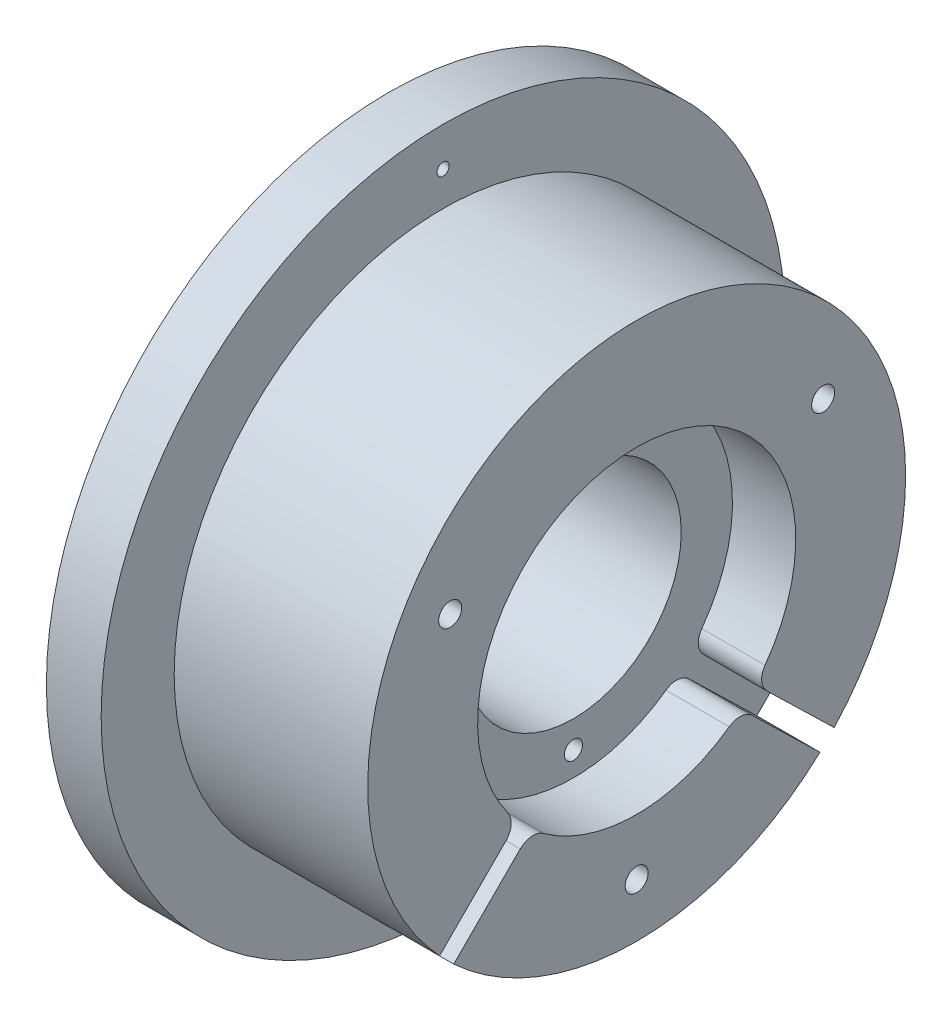
ISO-10303-21;
HEADER;
FILE_DESCRIPTION(('STEP AP214'),'2;1');
FILE_NAME('part.step','',(''),(''),'','','');
FILE_SCHEMA(('AUTOMOTIVE_DESIGN { 1 0 10303 214 1 1 1 1 }'));
ENDSEC;
DATA;
#1=APPLICATION_CONTEXT('core data for automotive mechanical design processes');
#2=APPLICATION_PROTOCOL_DEFINITION('international standard','automotive_design',2000,#1);
#3=PRODUCT_CONTEXT('',#1,'mechanical');
#4=PRODUCT('Part','Part','',(#3));
#5=PRODUCT_RELATED_PRODUCT_CATEGORY('part','',(#4));
#6=PRODUCT_DEFINITION_FORMATION('','',#4);
#7=PRODUCT_DEFINITION_CONTEXT('part definition',#1,'design');
#8=PRODUCT_DEFINITION('design','',#6,#7);
#9=PRODUCT_DEFINITION_SHAPE('','',#8);
#10=(LENGTH_UNIT() NAMED_UNIT(*) SI_UNIT(.MILLI.,.METRE.));
#11=(NAMED_UNIT(*) PLANE_ANGLE_UNIT() SI_UNIT($,.RADIAN.));
#12=(NAMED_UNIT(*) SI_UNIT($,.STERADIAN.) SOLID_ANGLE_UNIT());
#13=UNCERTAINTY_MEASURE_WITH_UNIT(LENGTH_MEASURE(1.E-05),#10,'distance_accuracy_value','');
#14=(GEOMETRIC_REPRESENTATION_CONTEXT(3) GLOBAL_UNCERTAINTY_ASSIGNED_CONTEXT((#13)) GLOBAL_UNIT_ASSIGNED_CONTEXT((#10,
#11,#12)) REPRESENTATION_CONTEXT('',''));
#15=CARTESIAN_POINT('',(0.,0.,0.));
#16=DIRECTION('',(0.,0.,1.));
#17=DIRECTION('',(1.,0.,0.));
#18=AXIS2_PLACEMENT_3D('',#15,#16,#17);
#19=CARTESIAN_POINT('',(12.872,0.,0.));
#20=DIRECTION('',(1.,0.,0.));
#21=DIRECTION('',(0.,0.,-1.));
#22=AXIS2_PLACEMENT_3D('',#19,#20,#21);
#23=CYLINDRICAL_SURFACE('',#22,11.0635);
#24=CARTESIAN_POINT('',(17.272,0.,0.));
#25=DIRECTION('',(1.,0.,0.));
#26=DIRECTION('',(0.,0.,-1.));
#27=AXIS2_PLACEMENT_3D('',#24,#25,#26);
#28=CIRCLE('',#27,11.0635);
#29=CARTESIAN_POINT('',(17.272,-6.53055533839923,-8.93044675378032));
#30=VERTEX_POINT('',#29);
#31=CARTESIAN_POINT('',(17.272,-6.48547246653702,8.96324043724089));
#32=VERTEX_POINT('',#31);
#33=EDGE_CURVE('E270',#30,#32,#28,.T.);
#34=ORIENTED_EDGE('',*,*,#33,.T.);
#35=DIRECTION('',(1.,0.,0.));
#36=VECTOR('',#35,1.);
#37=CARTESIAN_POINT('',(12.872,-6.48547246653702,8.96324043724089));
#38=LINE('',#37,#36);
#39=CARTESIAN_POINT('',(12.872,-6.48547246653702,8.96324043724089));
#40=VERTEX_POINT('',#39);
#41=EDGE_CURVE('E289',#32,#40,#38,.F.);
#42=ORIENTED_EDGE('',*,*,#41,.T.);
#43=CARTESIAN_POINT('',(12.872,0.,0.));
#44=DIRECTION('',(1.,0.,0.));
#45=DIRECTION('',(0.,0.,-1.));
#46=AXIS2_PLACEMENT_3D('',#43,#44,#45);
#47=CIRCLE('',#46,11.0635);
#48=CARTESIAN_POINT('',(12.872,-6.53055533839923,-8.93044675378032));
#49=VERTEX_POINT('',#48);
#50=EDGE_CURVE('E274',#49,#40,#47,.T.);
#51=ORIENTED_EDGE('',*,*,#50,.F.);
#52=DIRECTION('',(1.,0.,0.));
#53=VECTOR('',#52,1.);
#54=CARTESIAN_POINT('',(12.872,-6.53055533839923,-8.93044675378032));
#55=LINE('',#54,#53);
#56=EDGE_CURVE('E287',#49,#30,#55,.T.);
#57=ORIENTED_EDGE('',*,*,#56,.T.);
#58=EDGE_LOOP('',(#34,#42,#51,#57));
#59=FACE_BOUND('',#58,.T.);
#60=ADVANCED_FACE('F77',(#59),#23,.F.);
#61=CARTESIAN_POINT('',(12.872,-8.963240437241,6.48547246653686));
#62=VERTEX_POINT('',#61);
#63=CARTESIAN_POINT('',(12.872,-8.99622472916227,-6.43964074094272));
#64=VERTEX_POINT('',#63);
#65=EDGE_CURVE('E275',#62,#64,#47,.T.);
#66=ORIENTED_EDGE('',*,*,#65,.F.);
#67=DIRECTION('',(1.,0.,0.));
#68=VECTOR('',#67,1.);
#69=CARTESIAN_POINT('',(12.872,-8.96324043724101,6.48547246653686));
#70=LINE('',#69,#68);
#71=CARTESIAN_POINT('',(17.272,-8.963240437241,6.48547246653686));
#72=VERTEX_POINT('',#71);
#73=EDGE_CURVE('E296',#62,#72,#70,.T.);
#74=ORIENTED_EDGE('',*,*,#73,.T.);
#75=CARTESIAN_POINT('',(17.272,-8.99622472916227,-6.43964074094272));
#76=VERTEX_POINT('',#75);
#77=EDGE_CURVE('E271',#72,#76,#28,.T.);
#78=ORIENTED_EDGE('',*,*,#77,.T.);
#79=DIRECTION('',(1.,0.,0.));
#80=VECTOR('',#79,1.);
#81=CARTESIAN_POINT('',(12.872,-8.99622472916227,-6.43964074094272));
#82=LINE('',#81,#80);
#83=EDGE_CURVE('E294',#76,#64,#82,.F.);
#84=ORIENTED_EDGE('',*,*,#83,.T.);
#85=EDGE_LOOP('',(#66,#74,#78,#84));
#86=FACE_BOUND('',#85,.T.);
#87=ADVANCED_FACE('F317',(#86),#23,.F.);
#88=CARTESIAN_POINT('',(17.272,0.,0.));
#89=DIRECTION('',(-1.,0.,0.));
#90=DIRECTION('',(0.,0.,1.));
#91=AXIS2_PLACEMENT_3D('',#88,#89,#90);
#92=PLANE('',#91);
#93=CARTESIAN_POINT('',(17.272,7.48875,12.9708954851814));
#94=DIRECTION('',(1.,0.,0.));
#95=DIRECTION('',(0.,0.,-1.));
#96=AXIS2_PLACEMENT_3D('',#93,#94,#95);
#97=CIRCLE('',#96,0.79999999999999);
#98=CARTESIAN_POINT('',(17.272,7.48875,12.1708954851814));
#99=VERTEX_POINT('',#98);
#100=EDGE_CURVE('E183',#99,#99,#97,.T.);
#101=ORIENTED_EDGE('',*,*,#100,.F.);
#102=EDGE_LOOP('',(#101));
#103=FACE_BOUND('',#102,.T.);
#104=CARTESIAN_POINT('',(17.272,7.48875000000001,-12.9708954851814));
#105=DIRECTION('',(1.,0.,0.));
#106=DIRECTION('',(0.,0.,-1.));
#107=AXIS2_PLACEMENT_3D('',#104,#105,#106);
#108=CIRCLE('',#107,0.79999999999999);
#109=CARTESIAN_POINT('',(17.272,7.48875000000001,-13.7708954851814));
#110=VERTEX_POINT('',#109);
#111=EDGE_CURVE('E182',#110,#110,#108,.T.);
#112=ORIENTED_EDGE('',*,*,#111,.F.);
#113=EDGE_LOOP('',(#112));
#114=FACE_BOUND('',#113,.T.);
#115=DIRECTION('',(0.,0.707106781186554,-0.707106781186541));
#116=VECTOR('',#115,1.);
#117=CARTESIAN_POINT('',(17.272,0.494974746830583,0.494974746830592));
#118=LINE('',#117,#116);
#119=CARTESIAN_POINT('',(17.272,-12.7236785584424,13.7136280521033));
#120=VERTEX_POINT('',#119);
#121=CARTESIAN_POINT('',(17.272,-8.1021114528653,9.09206094652632));
#122=VERTEX_POINT('',#121);
#123=EDGE_CURVE('E240',#120,#122,#118,.T.);
#124=ORIENTED_EDGE('',*,*,#123,.T.);
#125=CARTESIAN_POINT('',(17.272,-7.21822797638212,9.97594442300951));
#126=DIRECTION('',(-1.,0.,0.));
#127=DIRECTION('',(0.,0.,1.));
#128=AXIS2_PLACEMENT_3D('',#125,#126,#127);
#129=CIRCLE('',#128,1.25);
#130=EDGE_CURVE('E285',#122,#32,#129,.F.);
#131=ORIENTED_EDGE('',*,*,#130,.T.);
#132=ORIENTED_EDGE('',*,*,#33,.F.);
#133=CARTESIAN_POINT('',(17.272,-7.26840449761638,-9.9394455735232));
#134=DIRECTION('',(-1.,0.,0.));
#135=DIRECTION('',(0.,0.,1.));
#136=AXIS2_PLACEMENT_3D('',#133,#134,#135);
#137=CIRCLE('',#136,1.25);
#138=CARTESIAN_POINT('',(17.272,-8.16548854366934,-9.06896282566586));
#139=VERTEX_POINT('',#138);
#140=EDGE_CURVE('E283',#30,#139,#137,.F.);
#141=ORIENTED_EDGE('',*,*,#140,.T.);
#142=DIRECTION('',(0.,-0.696386198285868,-0.717667236842365));
#143=VECTOR('',#142,1.);
#144=CARTESIAN_POINT('',(17.272,0.326823466436906,-0.317132146514021));
#145=LINE('',#144,#143);
#146=CARTESIAN_POINT('',(17.272,-12.6966821527148,-13.7386263040718));
#147=VERTEX_POINT('',#146);
#148=EDGE_CURVE('E218',#139,#147,#145,.T.);
#149=ORIENTED_EDGE('',*,*,#148,.T.);
#150=CARTESIAN_POINT('',(17.272,0.,0.));
#151=DIRECTION('',(1.,0.,0.));
#152=DIRECTION('',(0.,0.,-1.));
#153=AXIS2_PLACEMENT_3D('',#150,#151,#152);
#154=CIRCLE('',#153,18.7071);
#155=EDGE_CURVE('E266',#147,#120,#154,.T.);
#156=ORIENTED_EDGE('',*,*,#155,.T.);
#157=EDGE_LOOP('',(#124,#131,#132,#141,#149,#156));
#158=FACE_BOUND('',#157,.T.);
#159=ADVANCED_FACE('F354',(#103,#114,#158),#92,.F.);
#160=CARTESIAN_POINT('',(17.272,-14.9775,0.));
#161=DIRECTION('',(1.,0.,0.));
#162=DIRECTION('',(0.,0.,-1.));
#163=AXIS2_PLACEMENT_3D('',#160,#161,#162);
#164=CIRCLE('',#163,0.79999999999999);
#165=CARTESIAN_POINT('',(17.272,-14.9775,-0.799999999999992));
#166=VERTEX_POINT('',#165);
#167=EDGE_CURVE('E193',#166,#166,#164,.T.);
#168=ORIENTED_EDGE('',*,*,#167,.F.);
#169=EDGE_LOOP('',(#168));
#170=FACE_BOUND('',#169,.T.);
#171=ORIENTED_EDGE('',*,*,#77,.F.);
#172=CARTESIAN_POINT('',(17.272,-9.97594442300963,7.21822797638195));
#173=DIRECTION('',(-1.,0.,0.));
#174=DIRECTION('',(0.,0.,1.));
#175=AXIS2_PLACEMENT_3D('',#172,#173,#174);
#176=CIRCLE('',#175,1.25);
#177=CARTESIAN_POINT('',(17.272,-9.09206094652646,8.10211145286514));
#178=VERTEX_POINT('',#177);
#179=EDGE_CURVE('E300',#72,#178,#176,.F.);
#180=ORIENTED_EDGE('',*,*,#179,.T.);
#181=DIRECTION('',(0.,-0.707106781186553,0.707106781186542));
#182=VECTOR('',#181,1.);
#183=CARTESIAN_POINT('',(17.272,-0.494974746830585,-0.494974746830593));
#184=LINE('',#183,#182);
#185=CARTESIAN_POINT('',(17.272,-13.7136280521035,12.7236785584421));
#186=VERTEX_POINT('',#185);
#187=EDGE_CURVE('E236',#178,#186,#184,.T.);
#188=ORIENTED_EDGE('',*,*,#187,.T.);
#189=CARTESIAN_POINT('',(17.272,-13.6886585047887,-12.7505379788179));
#190=VERTEX_POINT('',#189);
#191=EDGE_CURVE('E267',#186,#190,#154,.T.);
#192=ORIENTED_EDGE('',*,*,#191,.T.);
#193=DIRECTION('',(0.,0.696386198285868,0.717667236842366));
#194=VECTOR('',#193,1.);
#195=CARTESIAN_POINT('',(17.272,-0.677910665142419,0.657808531086206));
#196=LINE('',#195,#194);
#197=CARTESIAN_POINT('',(17.272,-9.11557137063612,-8.03770074068042));
#198=VERTEX_POINT('',#197);
#199=EDGE_CURVE('E222',#190,#198,#196,.T.);
#200=ORIENTED_EDGE('',*,*,#199,.T.);
#201=CARTESIAN_POINT('',(17.272,-10.0126554166891,-7.16721799282308));
#202=DIRECTION('',(-1.,0.,0.));
#203=DIRECTION('',(0.,0.,1.));
#204=AXIS2_PLACEMENT_3D('',#201,#202,#203);
#205=CIRCLE('',#204,1.25);
#206=EDGE_CURVE('E298',#198,#76,#205,.F.);
#207=ORIENTED_EDGE('',*,*,#206,.T.);
#208=EDGE_LOOP('',(#171,#180,#188,#192,#200,#207));
#209=FACE_BOUND('',#208,.T.);
#210=ADVANCED_FACE('F324',(#170,#209),#92,.F.);
#211=CARTESIAN_POINT('',(12.872,0.,0.));
#212=DIRECTION('',(1.,0.,0.));
#213=DIRECTION('',(0.,0.,-1.));
#214=AXIS2_PLACEMENT_3D('',#211,#212,#213);
#215=CYLINDRICAL_SURFACE('',#214,18.7071);
#216=CARTESIAN_POINT('',(3.81,0.,0.));
#217=DIRECTION('',(1.,0.,0.));
#218=DIRECTION('',(0.,0.,-1.));
#219=AXIS2_PLACEMENT_3D('',#216,#217,#218);
#220=CIRCLE('',#219,18.7071);
#221=CARTESIAN_POINT('',(3.81,0.,-18.7071));
#222=VERTEX_POINT('',#221);
#223=EDGE_CURVE('E263',#222,#222,#220,.T.);
#224=ORIENTED_EDGE('',*,*,#223,.T.);
#225=EDGE_LOOP('',(#224));
#226=FACE_BOUND('',#225,.T.);
#227=DIRECTION('',(1.,0.,0.));
#228=VECTOR('',#227,1.);
#229=CARTESIAN_POINT('',(-6.87510074540848,-12.6966821527148,-13.7386263040718));
#230=LINE('',#229,#228);
#231=CARTESIAN_POINT('',(12.872,-12.6966821527148,-13.7386263040718));
#232=VERTEX_POINT('',#231);
#233=EDGE_CURVE('E221',#232,#147,#230,.T.);
#234=ORIENTED_EDGE('',*,*,#233,.F.);
#235=CARTESIAN_POINT('',(12.872,0.,0.));
#236=DIRECTION('',(-1.,0.,0.));
#237=DIRECTION('',(0.,0.,1.));
#238=AXIS2_PLACEMENT_3D('',#235,#236,#237);
#239=CIRCLE('',#238,18.7071);
#240=CARTESIAN_POINT('',(12.872,-13.6886585047887,-12.7505379788179));
#241=VERTEX_POINT('',#240);
#242=EDGE_CURVE('E226',#241,#232,#239,.F.);
#243=ORIENTED_EDGE('',*,*,#242,.F.);
#244=DIRECTION('',(1.,0.,0.));
#245=VECTOR('',#244,1.);
#246=CARTESIAN_POINT('',(-6.87510074540848,-13.6886585047887,-12.7505379788179));
#247=LINE('',#246,#245);
#248=EDGE_CURVE('E220',#241,#190,#247,.T.);
#249=ORIENTED_EDGE('',*,*,#248,.T.);
#250=ORIENTED_EDGE('',*,*,#191,.F.);
#251=DIRECTION('',(1.,0.,0.));
#252=VECTOR('',#251,1.);
#253=CARTESIAN_POINT('',(-6.87510074540848,-13.7136280521035,12.7236785584421));
#254=LINE('',#253,#252);
#255=CARTESIAN_POINT('',(12.872,-13.7136280521035,12.7236785584421));
#256=VERTEX_POINT('',#255);
#257=EDGE_CURVE('E239',#256,#186,#254,.T.);
#258=ORIENTED_EDGE('',*,*,#257,.F.);
#259=CARTESIAN_POINT('',(12.872,0.,0.));
#260=DIRECTION('',(-1.,0.,0.));
#261=DIRECTION('',(0.,0.,1.));
#262=AXIS2_PLACEMENT_3D('',#259,#260,#261);
#263=CIRCLE('',#262,18.7071);
#264=CARTESIAN_POINT('',(12.872,-12.7236785584424,13.7136280521033));
#265=VERTEX_POINT('',#264);
#266=EDGE_CURVE('E243',#265,#256,#263,.F.);
#267=ORIENTED_EDGE('',*,*,#266,.F.);
#268=DIRECTION('',(1.,0.,0.));
#269=VECTOR('',#268,1.);
#270=CARTESIAN_POINT('',(-6.87510074540848,-12.7236785584424,13.7136280521033));
#271=LINE('',#270,#269);
#272=EDGE_CURVE('E244',#265,#120,#271,.T.);
#273=ORIENTED_EDGE('',*,*,#272,.T.);
#274=ORIENTED_EDGE('',*,*,#155,.F.);
#275=EDGE_LOOP('',(#234,#243,#249,#250,#258,#267,#273,#274));
#276=FACE_BOUND('',#275,.T.);
#277=ADVANCED_FACE('F332',(#226,#276),#215,.T.);
#278=CARTESIAN_POINT('',(12.872,0.,0.));
#279=DIRECTION('',(1.,0.,0.));
#280=DIRECTION('',(0.,0.,-1.));
#281=AXIS2_PLACEMENT_3D('',#278,#279,#280);
#282=CYLINDRICAL_SURFACE('',#281,7.5);
#283=CARTESIAN_POINT('',(0.,0.,0.));
#284=DIRECTION('',(1.,0.,0.));
#285=DIRECTION('',(0.,0.,-1.));
#286=AXIS2_PLACEMENT_3D('',#283,#284,#285);
#287=CIRCLE('',#286,7.5);
#288=CARTESIAN_POINT('',(0.,0.,-7.5));
#289=VERTEX_POINT('',#288);
#290=EDGE_CURVE('E238',#289,#289,#287,.T.);
#291=ORIENTED_EDGE('',*,*,#290,.F.);
#292=EDGE_LOOP('',(#291));
#293=FACE_BOUND('',#292,.T.);
#294=CARTESIAN_POINT('',(12.872,0.,0.));
#295=DIRECTION('',(1.,0.,0.));
#296=DIRECTION('',(0.,0.,-1.));
#297=AXIS2_PLACEMENT_3D('',#294,#295,#296);
#298=CIRCLE('',#297,7.5);
#299=CARTESIAN_POINT('',(12.872,0.,-7.5));
#300=VERTEX_POINT('',#299);
#301=EDGE_CURVE('E277',#300,#300,#298,.T.);
#302=ORIENTED_EDGE('',*,*,#301,.T.);
#303=EDGE_LOOP('',(#302));
#304=FACE_BOUND('',#303,.T.);
#305=ADVANCED_FACE('F362',(#293,#304),#282,.F.);
#306=CARTESIAN_POINT('',(12.872,0.,0.));
#307=DIRECTION('',(-1.,0.,0.));
#308=DIRECTION('',(0.,0.,1.));
#309=AXIS2_PLACEMENT_3D('',#306,#307,#308);
#310=PLANE('',#309);
#311=CARTESIAN_POINT('',(12.872,9.375,0.));
#312=DIRECTION('',(1.,0.,0.));
#313=DIRECTION('',(0.,1.,0.));
#314=AXIS2_PLACEMENT_3D('',#311,#312,#313);
#315=CIRCLE('',#314,0.635);
#316=CARTESIAN_POINT('',(12.872,10.01,0.));
#317=VERTEX_POINT('',#316);
#318=EDGE_CURVE('E204',#317,#317,#315,.T.);
#319=ORIENTED_EDGE('',*,*,#318,.F.);
#320=EDGE_LOOP('',(#319));
#321=FACE_BOUND('',#320,.T.);
#322=CARTESIAN_POINT('',(12.872,-9.375,0.));
#323=DIRECTION('',(1.,0.,0.));
#324=DIRECTION('',(0.,1.,0.));
#325=AXIS2_PLACEMENT_3D('',#322,#323,#324);
#326=CIRCLE('',#325,0.635);
#327=CARTESIAN_POINT('',(12.872,-8.74,0.));
#328=VERTEX_POINT('',#327);
#329=EDGE_CURVE('E199',#328,#328,#326,.T.);
#330=ORIENTED_EDGE('',*,*,#329,.F.);
#331=EDGE_LOOP('',(#330));
#332=FACE_BOUND('',#331,.T.);
#333=ORIENTED_EDGE('',*,*,#301,.F.);
#334=EDGE_LOOP('',(#333));
#335=FACE_BOUND('',#334,.T.);
#336=DIRECTION('',(0.,-0.707106781186553,0.707106781186542));
#337=VECTOR('',#336,1.);
#338=CARTESIAN_POINT('',(12.872,-0.494974746830585,-0.494974746830594));
#339=LINE('',#338,#337);
#340=CARTESIAN_POINT('',(12.872,-9.09206094652646,8.10211145286514));
#341=VERTEX_POINT('',#340);
#342=EDGE_CURVE('E225',#341,#256,#339,.T.);
#343=ORIENTED_EDGE('',*,*,#342,.F.);
#344=CARTESIAN_POINT('',(12.872,-9.97594442300963,7.21822797638195));
#345=DIRECTION('',(-1.,0.,0.));
#346=DIRECTION('',(0.,0.,1.));
#347=AXIS2_PLACEMENT_3D('',#344,#345,#346);
#348=CIRCLE('',#347,1.25);
#349=EDGE_CURVE('E309',#341,#62,#348,.T.);
#350=ORIENTED_EDGE('',*,*,#349,.T.);
#351=ORIENTED_EDGE('',*,*,#65,.T.);
#352=CARTESIAN_POINT('',(12.872,-10.0126554166891,-7.16721799282308));
#353=DIRECTION('',(-1.,0.,0.));
#354=DIRECTION('',(0.,0.,1.));
#355=AXIS2_PLACEMENT_3D('',#352,#353,#354);
#356=CIRCLE('',#355,1.25);
#357=CARTESIAN_POINT('',(12.872,-9.11557137063612,-8.03770074068042));
#358=VERTEX_POINT('',#357);
#359=EDGE_CURVE('E85',#64,#358,#356,.T.);
#360=ORIENTED_EDGE('',*,*,#359,.T.);
#361=DIRECTION('',(0.,0.696386198285868,0.717667236842366));
#362=VECTOR('',#361,1.);
#363=CARTESIAN_POINT('',(12.872,-0.677910665142419,0.657808531086206));
#364=LINE('',#363,#362);
#365=EDGE_CURVE('E215',#241,#358,#364,.T.);
#366=ORIENTED_EDGE('',*,*,#365,.F.);
#367=ORIENTED_EDGE('',*,*,#242,.T.);
#368=DIRECTION('',(0.,-0.696386198285868,-0.717667236842365));
#369=VECTOR('',#368,1.);
#370=CARTESIAN_POINT('',(12.872,0.326823466436906,-0.317132146514021));
#371=LINE('',#370,#369);
#372=CARTESIAN_POINT('',(12.872,-8.16548854366934,-9.06896282566586));
#373=VERTEX_POINT('',#372);
#374=EDGE_CURVE('E229',#373,#232,#371,.T.);
#375=ORIENTED_EDGE('',*,*,#374,.F.);
#376=CARTESIAN_POINT('',(12.872,-7.26840449761638,-9.9394455735232));
#377=DIRECTION('',(-1.,0.,0.));
#378=DIRECTION('',(0.,0.,1.));
#379=AXIS2_PLACEMENT_3D('',#376,#377,#378);
#380=CIRCLE('',#379,1.25);
#381=EDGE_CURVE('E12',#373,#49,#380,.T.);
#382=ORIENTED_EDGE('',*,*,#381,.T.);
#383=ORIENTED_EDGE('',*,*,#50,.T.);
#384=CARTESIAN_POINT('',(12.872,-7.21822797638212,9.97594442300951));
#385=DIRECTION('',(-1.,0.,0.));
#386=DIRECTION('',(0.,0.,1.));
#387=AXIS2_PLACEMENT_3D('',#384,#385,#386);
#388=CIRCLE('',#387,1.25);
#389=CARTESIAN_POINT('',(12.872,-8.1021114528653,9.09206094652632));
#390=VERTEX_POINT('',#389);
#391=EDGE_CURVE('E307',#40,#390,#388,.T.);
#392=ORIENTED_EDGE('',*,*,#391,.T.);
#393=DIRECTION('',(0.,0.707106781186554,-0.707106781186541));
#394=VECTOR('',#393,1.);
#395=CARTESIAN_POINT('',(12.872,0.494974746830584,0.494974746830592));
#396=LINE('',#395,#394);
#397=EDGE_CURVE('E246',#265,#390,#396,.T.);
#398=ORIENTED_EDGE('',*,*,#397,.F.);
#399=ORIENTED_EDGE('',*,*,#266,.T.);
#400=EDGE_LOOP('',(#343,#350,#351,#360,#366,#367,#375,#382,#383,#392,#398,#399));
#401=FACE_BOUND('',#400,.T.);
#402=ADVANCED_FACE('F312',(#321,#332,#335,#401),#310,.F.);
#403=CARTESIAN_POINT('',(3.81,0.,0.));
#404=DIRECTION('',(-1.,0.,0.));
#405=DIRECTION('',(0.,0.,1.));
#406=AXIS2_PLACEMENT_3D('',#403,#404,#405);
#407=PLANE('',#406);
#408=CARTESIAN_POINT('',(3.81,21.082,0.));
#409=DIRECTION('',(1.,0.,0.));
#410=DIRECTION('',(0.,1.,0.));
#411=AXIS2_PLACEMENT_3D('',#408,#409,#410);
#412=CIRCLE('',#411,0.425000000000001);
#413=CARTESIAN_POINT('',(3.81,21.507,0.));
#414=VERTEX_POINT('',#413);
#415=EDGE_CURVE('E203',#414,#414,#412,.T.);
#416=ORIENTED_EDGE('',*,*,#415,.F.);
#417=EDGE_LOOP('',(#416));
#418=FACE_BOUND('',#417,.T.);
#419=ORIENTED_EDGE('',*,*,#223,.F.);
#420=EDGE_LOOP('',(#419));
#421=FACE_BOUND('',#420,.T.);
#422=CARTESIAN_POINT('',(3.81,0.,0.));
#423=DIRECTION('',(1.,0.,0.));
#424=DIRECTION('',(0.,0.,-1.));
#425=AXIS2_PLACEMENT_3D('',#422,#423,#424);
#426=CIRCLE('',#425,23.7871);
#427=CARTESIAN_POINT('',(3.81,0.,-23.7871));
#428=VERTEX_POINT('',#427);
#429=EDGE_CURVE('E260',#428,#428,#426,.T.);
#430=ORIENTED_EDGE('',*,*,#429,.T.);
#431=EDGE_LOOP('',(#430));
#432=FACE_BOUND('',#431,.T.);
#433=ADVANCED_FACE('F361',(#418,#421,#432),#407,.F.);
#434=CARTESIAN_POINT('',(12.872,0.,0.));
#435=DIRECTION('',(1.,0.,0.));
#436=DIRECTION('',(0.,0.,-1.));
#437=AXIS2_PLACEMENT_3D('',#434,#435,#436);
#438=CYLINDRICAL_SURFACE('',#437,23.7871);
#439=ORIENTED_EDGE('',*,*,#429,.F.);
#440=EDGE_LOOP('',(#439));
#441=FACE_BOUND('',#440,.T.);
#442=CARTESIAN_POINT('',(0.,0.,0.));
#443=DIRECTION('',(1.,0.,0.));
#444=DIRECTION('',(0.,0.,-1.));
#445=AXIS2_PLACEMENT_3D('',#442,#443,#444);
#446=CIRCLE('',#445,23.7871);
#447=CARTESIAN_POINT('',(0.,0.,-23.7871));
#448=VERTEX_POINT('',#447);
#449=EDGE_CURVE('E257',#448,#448,#446,.T.);
#450=ORIENTED_EDGE('',*,*,#449,.T.);
#451=EDGE_LOOP('',(#450));
#452=FACE_BOUND('',#451,.T.);
#453=ADVANCED_FACE('F409',(#441,#452),#438,.T.);
#454=CARTESIAN_POINT('',(0.,0.,0.));
#455=DIRECTION('',(1.,0.,0.));
#456=DIRECTION('',(0.,0.,-1.));
#457=AXIS2_PLACEMENT_3D('',#454,#455,#456);
#458=PLANE('',#457);
#459=CARTESIAN_POINT('',(0.,9.375,0.));
#460=DIRECTION('',(1.,0.,0.));
#461=DIRECTION('',(0.,1.,0.));
#462=AXIS2_PLACEMENT_3D('',#459,#460,#461);
#463=CIRCLE('',#462,0.635);
#464=CARTESIAN_POINT('',(0.,10.01,0.));
#465=VERTEX_POINT('',#464);
#466=EDGE_CURVE('E200',#465,#465,#463,.T.);
#467=ORIENTED_EDGE('',*,*,#466,.T.);
#468=EDGE_LOOP('',(#467));
#469=FACE_BOUND('',#468,.T.);
#470=CARTESIAN_POINT('',(0.,-9.375,0.));
#471=DIRECTION('',(1.,0.,0.));
#472=DIRECTION('',(0.,1.,0.));
#473=AXIS2_PLACEMENT_3D('',#470,#471,#472);
#474=CIRCLE('',#473,0.635);
#475=CARTESIAN_POINT('',(0.,-8.74,0.));
#476=VERTEX_POINT('',#475);
#477=EDGE_CURVE('E207',#476,#476,#474,.T.);
#478=ORIENTED_EDGE('',*,*,#477,.T.);
#479=EDGE_LOOP('',(#478));
#480=FACE_BOUND('',#479,.T.);
#481=CARTESIAN_POINT('',(0.,21.082,0.));
#482=DIRECTION('',(1.,0.,0.));
#483=DIRECTION('',(0.,1.,0.));
#484=AXIS2_PLACEMENT_3D('',#481,#482,#483);
#485=CIRCLE('',#484,0.425000000000001);
#486=CARTESIAN_POINT('',(0.,21.507,0.));
#487=VERTEX_POINT('',#486);
#488=EDGE_CURVE('E212',#487,#487,#485,.T.);
#489=ORIENTED_EDGE('',*,*,#488,.T.);
#490=EDGE_LOOP('',(#489));
#491=FACE_BOUND('',#490,.T.);
#492=ORIENTED_EDGE('',*,*,#449,.F.);
#493=EDGE_LOOP('',(#492));
#494=FACE_BOUND('',#493,.T.);
#495=ORIENTED_EDGE('',*,*,#290,.T.);
#496=EDGE_LOOP('',(#495));
#497=FACE_BOUND('',#496,.T.);
#498=ADVANCED_FACE('F406',(#469,#480,#491,#494,#497),#458,.F.);
#499=CARTESIAN_POINT('',(-6.87510074540848,0.494974746830584,0.494974746830592));
#500=DIRECTION('',(0.,-0.707106781186541,-0.707106781186554));
#501=DIRECTION('',(0.,0.707106781186554,-0.707106781186541));
#502=AXIS2_PLACEMENT_3D('',#499,#500,#501);
#503=PLANE('',#502);
#504=ORIENTED_EDGE('',*,*,#397,.T.);
#505=DIRECTION('',(-1.,0.,0.));
#506=VECTOR('',#505,1.);
#507=CARTESIAN_POINT('',(17.272,-8.1021114528653,9.09206094652632));
#508=LINE('',#507,#506);
#509=EDGE_CURVE('E280',#390,#122,#508,.F.);
#510=ORIENTED_EDGE('',*,*,#509,.T.);
#511=ORIENTED_EDGE('',*,*,#123,.F.);
#512=ORIENTED_EDGE('',*,*,#272,.F.);
#513=EDGE_LOOP('',(#504,#510,#511,#512));
#514=FACE_BOUND('',#513,.T.);
#515=ADVANCED_FACE('F383',(#514),#503,.T.);
#516=CARTESIAN_POINT('',(-6.87510074540848,-0.494974746830585,-0.494974746830593));
#517=DIRECTION('',(0.,0.707106781186542,0.707106781186553));
#518=DIRECTION('',(0.,-0.707106781186553,0.707106781186542));
#519=AXIS2_PLACEMENT_3D('',#516,#517,#518);
#520=PLANE('',#519);
#521=ORIENTED_EDGE('',*,*,#187,.F.);
#522=DIRECTION('',(-1.,0.,0.));
#523=VECTOR('',#522,1.);
#524=CARTESIAN_POINT('',(12.872,-9.09206094652646,8.10211145286514));
#525=LINE('',#524,#523);
#526=EDGE_CURVE('E291',#178,#341,#525,.T.);
#527=ORIENTED_EDGE('',*,*,#526,.T.);
#528=ORIENTED_EDGE('',*,*,#342,.T.);
#529=ORIENTED_EDGE('',*,*,#257,.T.);
#530=EDGE_LOOP('',(#521,#527,#528,#529));
#531=FACE_BOUND('',#530,.T.);
#532=ADVANCED_FACE('F326',(#531),#520,.T.);
#533=CARTESIAN_POINT('',(-6.87510074540848,0.326823466436906,-0.317132146514021));
#534=DIRECTION('',(0.,-0.717667236842365,0.696386198285868));
#535=DIRECTION('',(0.,-0.696386198285868,-0.717667236842365));
#536=AXIS2_PLACEMENT_3D('',#533,#534,#535);
#537=PLANE('',#536);
#538=ORIENTED_EDGE('',*,*,#148,.F.);
#539=DIRECTION('',(-1.,0.,0.));
#540=VECTOR('',#539,1.);
#541=CARTESIAN_POINT('',(12.872,-8.16548854366934,-9.06896282566587));
#542=LINE('',#541,#540);
#543=EDGE_CURVE('E305',#139,#373,#542,.T.);
#544=ORIENTED_EDGE('',*,*,#543,.T.);
#545=ORIENTED_EDGE('',*,*,#374,.T.);
#546=ORIENTED_EDGE('',*,*,#233,.T.);
#547=EDGE_LOOP('',(#538,#544,#545,#546));
#548=FACE_BOUND('',#547,.T.);
#549=ADVANCED_FACE('F391',(#548),#537,.T.);
#550=CARTESIAN_POINT('',(-6.87510074540848,-0.677910665142418,0.657808531086206));
#551=DIRECTION('',(0.,0.717667236842366,-0.696386198285867));
#552=DIRECTION('',(0.,0.696386198285868,0.717667236842366));
#553=AXIS2_PLACEMENT_3D('',#550,#551,#552);
#554=PLANE('',#553);
#555=ORIENTED_EDGE('',*,*,#365,.T.);
#556=DIRECTION('',(-1.,0.,0.));
#557=VECTOR('',#556,1.);
#558=CARTESIAN_POINT('',(17.272,-9.11557137063612,-8.03770074068042));
#559=LINE('',#558,#557);
#560=EDGE_CURVE('E302',#358,#198,#559,.F.);
#561=ORIENTED_EDGE('',*,*,#560,.T.);
#562=ORIENTED_EDGE('',*,*,#199,.F.);
#563=ORIENTED_EDGE('',*,*,#248,.F.);
#564=EDGE_LOOP('',(#555,#561,#562,#563));
#565=FACE_BOUND('',#564,.T.);
#566=ADVANCED_FACE('F336',(#565),#554,.T.);
#567=CARTESIAN_POINT('',(0.,21.082,0.));
#568=DIRECTION('',(1.,0.,0.));
#569=DIRECTION('',(0.,1.,0.));
#570=AXIS2_PLACEMENT_3D('',#567,#568,#569);
#571=CYLINDRICAL_SURFACE('',#570,0.425000000000001);
#572=ORIENTED_EDGE('',*,*,#488,.F.);
#573=EDGE_LOOP('',(#572));
#574=FACE_BOUND('',#573,.T.);
#575=ORIENTED_EDGE('',*,*,#415,.T.);
#576=EDGE_LOOP('',(#575));
#577=FACE_BOUND('',#576,.T.);
#578=ADVANCED_FACE('F399',(#574,#577),#571,.F.);
#579=CARTESIAN_POINT('',(0.,-9.375,0.));
#580=DIRECTION('',(1.,0.,0.));
#581=DIRECTION('',(0.,1.,0.));
#582=AXIS2_PLACEMENT_3D('',#579,#580,#581);
#583=CYLINDRICAL_SURFACE('',#582,0.635);
#584=ORIENTED_EDGE('',*,*,#477,.F.);
#585=EDGE_LOOP('',(#584));
#586=FACE_BOUND('',#585,.T.);
#587=ORIENTED_EDGE('',*,*,#329,.T.);
#588=EDGE_LOOP('',(#587));
#589=FACE_BOUND('',#588,.T.);
#590=ADVANCED_FACE('F373',(#586,#589),#583,.F.);
#591=CARTESIAN_POINT('',(0.,9.375,0.));
#592=DIRECTION('',(1.,0.,0.));
#593=DIRECTION('',(0.,1.,0.));
#594=AXIS2_PLACEMENT_3D('',#591,#592,#593);
#595=CYLINDRICAL_SURFACE('',#594,0.635);
#596=ORIENTED_EDGE('',*,*,#466,.F.);
#597=EDGE_LOOP('',(#596));
#598=FACE_BOUND('',#597,.T.);
#599=ORIENTED_EDGE('',*,*,#318,.T.);
#600=EDGE_LOOP('',(#599));
#601=FACE_BOUND('',#600,.T.);
#602=ADVANCED_FACE('F368',(#598,#601),#595,.F.);
#603=CARTESIAN_POINT('',(12.872,-7.21822797638212,9.97594442300951));
#604=DIRECTION('',(1.,0.,0.));
#605=DIRECTION('',(0.,0.,-1.));
#606=AXIS2_PLACEMENT_3D('',#603,#604,#605);
#607=CYLINDRICAL_SURFACE('',#606,1.25);
#608=ORIENTED_EDGE('',*,*,#391,.F.);
#609=ORIENTED_EDGE('',*,*,#41,.F.);
#610=ORIENTED_EDGE('',*,*,#130,.F.);
#611=ORIENTED_EDGE('',*,*,#509,.F.);
#612=EDGE_LOOP('',(#608,#609,#610,#611));
#613=FACE_BOUND('',#612,.T.);
#614=ADVANCED_FACE('F346',(#613),#607,.T.);
#615=CARTESIAN_POINT('',(12.872,-9.97594442300963,7.21822797638195));
#616=DIRECTION('',(1.,0.,0.));
#617=DIRECTION('',(0.,0.,-1.));
#618=AXIS2_PLACEMENT_3D('',#615,#616,#617);
#619=CYLINDRICAL_SURFACE('',#618,1.25);
#620=ORIENTED_EDGE('',*,*,#179,.F.);
#621=ORIENTED_EDGE('',*,*,#73,.F.);
#622=ORIENTED_EDGE('',*,*,#349,.F.);
#623=ORIENTED_EDGE('',*,*,#526,.F.);
#624=EDGE_LOOP('',(#620,#621,#622,#623));
#625=FACE_BOUND('',#624,.T.);
#626=ADVANCED_FACE('F321',(#625),#619,.T.);
#627=CARTESIAN_POINT('',(12.872,-10.0126554166891,-7.16721799282308));
#628=DIRECTION('',(1.,0.,0.));
#629=DIRECTION('',(0.,0.,-1.));
#630=AXIS2_PLACEMENT_3D('',#627,#628,#629);
#631=CYLINDRICAL_SURFACE('',#630,1.25);
#632=ORIENTED_EDGE('',*,*,#359,.F.);
#633=ORIENTED_EDGE('',*,*,#83,.F.);
#634=ORIENTED_EDGE('',*,*,#206,.F.);
#635=ORIENTED_EDGE('',*,*,#560,.F.);
#636=EDGE_LOOP('',(#632,#633,#634,#635));
#637=FACE_BOUND('',#636,.T.);
#638=ADVANCED_FACE('F339',(#637),#631,.T.);
#639=CARTESIAN_POINT('',(12.872,-7.26840449761638,-9.9394455735232));
#640=DIRECTION('',(1.,0.,0.));
#641=DIRECTION('',(0.,0.,-1.));
#642=AXIS2_PLACEMENT_3D('',#639,#640,#641);
#643=CYLINDRICAL_SURFACE('',#642,1.25);
#644=ORIENTED_EDGE('',*,*,#140,.F.);
#645=ORIENTED_EDGE('',*,*,#56,.F.);
#646=ORIENTED_EDGE('',*,*,#381,.F.);
#647=ORIENTED_EDGE('',*,*,#543,.F.);
#648=EDGE_LOOP('',(#644,#645,#646,#647));
#649=FACE_BOUND('',#648,.T.);
#650=ADVANCED_FACE('F79',(#649),#643,.T.);
#651=CARTESIAN_POINT('',(9.772,-14.9775,0.));
#652=DIRECTION('',(1.,0.,0.));
#653=DIRECTION('',(0.,0.,-1.));
#654=AXIS2_PLACEMENT_3D('',#651,#652,#653);
#655=CONICAL_SURFACE('',#654,0.799999999999999,1.02974425867665);
#656=CARTESIAN_POINT('',(9.29131150477795,-14.9775,0.));
#657=VERTEX_POINT('',#656);
#658=VERTEX_LOOP('',#657);
#659=FACE_BOUND('',#658,.T.);
#660=CARTESIAN_POINT('',(9.772,-14.9775,0.));
#661=DIRECTION('',(1.,0.,0.));
#662=DIRECTION('',(0.,0.,-1.));
#663=AXIS2_PLACEMENT_3D('',#660,#661,#662);
#664=CIRCLE('',#663,0.799999999999999);
#665=CARTESIAN_POINT('',(9.772,-14.9775,-0.8));
#666=VERTEX_POINT('',#665);
#667=EDGE_CURVE('E196',#666,#666,#664,.T.);
#668=ORIENTED_EDGE('',*,*,#667,.T.);
#669=EDGE_LOOP('',(#668));
#670=FACE_BOUND('',#669,.T.);
#671=ADVANCED_FACE('F345',(#659,#670),#655,.F.);
#672=CARTESIAN_POINT('',(17.272,-14.9775,0.));
#673=DIRECTION('',(1.,0.,0.));
#674=DIRECTION('',(0.,0.,-1.));
#675=AXIS2_PLACEMENT_3D('',#672,#673,#674);
#676=CYLINDRICAL_SURFACE('',#675,0.799999999999994);
#677=ORIENTED_EDGE('',*,*,#667,.F.);
#678=EDGE_LOOP('',(#677));
#679=FACE_BOUND('',#678,.T.);
#680=ORIENTED_EDGE('',*,*,#167,.T.);
#681=EDGE_LOOP('',(#680));
#682=FACE_BOUND('',#681,.T.);
#683=ADVANCED_FACE('F440',(#679,#682),#676,.F.);
#684=CARTESIAN_POINT('',(9.772,7.48875000000001,-12.9708954851814));
#685=DIRECTION('',(1.,0.,0.));
#686=DIRECTION('',(0.,0.,-1.));
#687=AXIS2_PLACEMENT_3D('',#684,#685,#686);
#688=CONICAL_SURFACE('',#687,0.799999999999999,1.02974425867665);
#689=CARTESIAN_POINT('',(9.29131150477795,7.48875000000001,-12.9708954851814));
#690=VERTEX_POINT('',#689);
#691=VERTEX_LOOP('',#690);
#692=FACE_BOUND('',#691,.T.);
#693=CARTESIAN_POINT('',(9.772,7.48875000000001,-12.9708954851814));
#694=DIRECTION('',(1.,0.,0.));
#695=DIRECTION('',(0.,0.,-1.));
#696=AXIS2_PLACEMENT_3D('',#693,#694,#695);
#697=CIRCLE('',#696,0.799999999999999);
#698=CARTESIAN_POINT('',(9.772,7.48875000000001,-13.7708954851814));
#699=VERTEX_POINT('',#698);
#700=EDGE_CURVE('E186',#699,#699,#697,.T.);
#701=ORIENTED_EDGE('',*,*,#700,.T.);
#702=EDGE_LOOP('',(#701));
#703=FACE_BOUND('',#702,.T.);
#704=ADVANCED_FACE('F442',(#692,#703),#688,.F.);
#705=CARTESIAN_POINT('',(17.272,7.48875000000001,-12.9708954851814));
#706=DIRECTION('',(1.,0.,0.));
#707=DIRECTION('',(0.,0.,-1.));
#708=AXIS2_PLACEMENT_3D('',#705,#706,#707);
#709=CYLINDRICAL_SURFACE('',#708,0.799999999999994);
#710=ORIENTED_EDGE('',*,*,#700,.F.);
#711=EDGE_LOOP('',(#710));
#712=FACE_BOUND('',#711,.T.);
#713=ORIENTED_EDGE('',*,*,#111,.T.);
#714=EDGE_LOOP('',(#713));
#715=FACE_BOUND('',#714,.T.);
#716=ADVANCED_FACE('F176',(#712,#715),#709,.F.);
#717=CARTESIAN_POINT('',(9.772,7.48875,12.9708954851814));
#718=DIRECTION('',(1.,0.,0.));
#719=DIRECTION('',(0.,0.,-1.));
#720=AXIS2_PLACEMENT_3D('',#717,#718,#719);
#721=CONICAL_SURFACE('',#720,0.799999999999999,1.02974425867665);
#722=CARTESIAN_POINT('',(9.29131150477795,7.48874999999999,12.9708954851814));
#723=VERTEX_POINT('',#722);
#724=VERTEX_LOOP('',#723);
#725=FACE_BOUND('',#724,.T.);
#726=CARTESIAN_POINT('',(9.772,7.48875,12.9708954851814));
#727=DIRECTION('',(1.,0.,0.));
#728=DIRECTION('',(0.,0.,-1.));
#729=AXIS2_PLACEMENT_3D('',#726,#727,#728);
#730=CIRCLE('',#729,0.799999999999999);
#731=CARTESIAN_POINT('',(9.772,7.48875,12.1708954851814));
#732=VERTEX_POINT('',#731);
#733=EDGE_CURVE('E180',#732,#732,#730,.T.);
#734=ORIENTED_EDGE('',*,*,#733,.T.);
#735=EDGE_LOOP('',(#734));
#736=FACE_BOUND('',#735,.T.);
#737=ADVANCED_FACE('F172',(#725,#736),#721,.F.);
#738=CARTESIAN_POINT('',(17.272,7.48875,12.9708954851814));
#739=DIRECTION('',(1.,0.,0.));
#740=DIRECTION('',(0.,0.,-1.));
#741=AXIS2_PLACEMENT_3D('',#738,#739,#740);
#742=CYLINDRICAL_SURFACE('',#741,0.799999999999994);
#743=ORIENTED_EDGE('',*,*,#733,.F.);
#744=EDGE_LOOP('',(#743));
#745=FACE_BOUND('',#744,.T.);
#746=ORIENTED_EDGE('',*,*,#100,.T.);
#747=EDGE_LOOP('',(#746));
#748=FACE_BOUND('',#747,.T.);
#749=ADVANCED_FACE('F175',(#745,#748),#742,.F.);
#750=CLOSED_SHELL('',(#60,#87,#159,#210,#277,#305,#402,#433,#453,#498,#515,#532,#549,#566,#578,
#590,#602,#614,#626,#638,#650,#671,#683,#704,#716,#737,#749));
#751=MANIFOLD_SOLID_BREP('B2',#750);
#752=ADVANCED_BREP_SHAPE_REPRESENTATION('',(#18,#751),#14);
#753=SHAPE_DEFINITION_REPRESENTATION(#9,#752);
ENDSEC;
END-ISO-10303-21;
